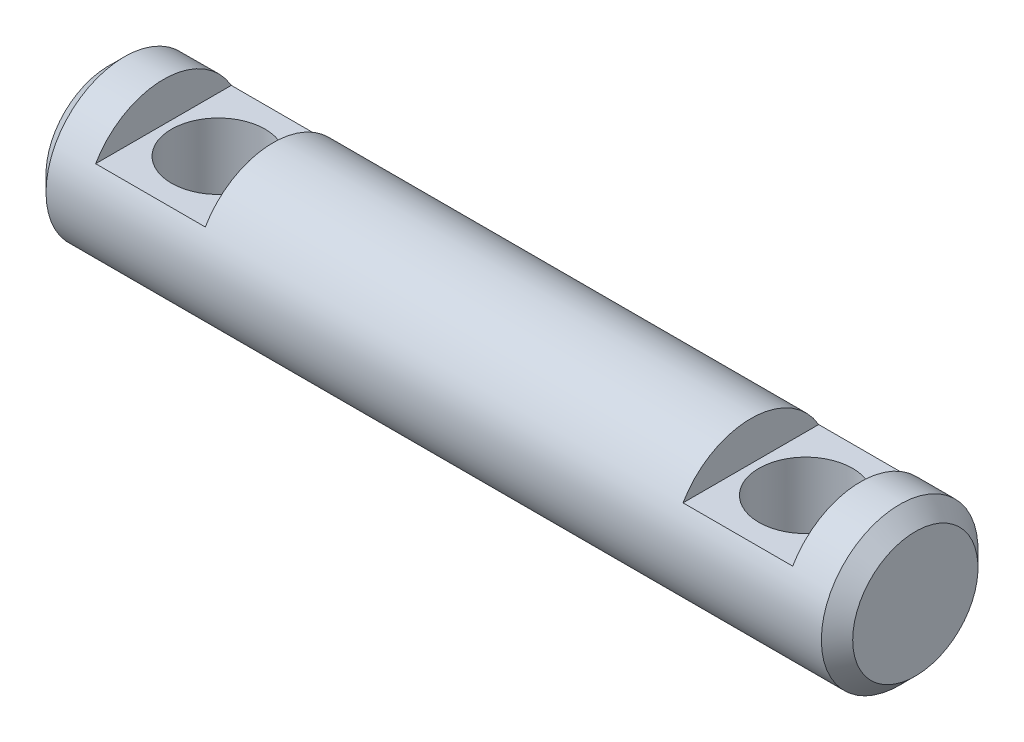
ISO-10303-21;
HEADER;
FILE_DESCRIPTION(('STEP AP214'),'2;1');
FILE_NAME('part.step','',(''),(''),'','','');
FILE_SCHEMA(('AUTOMOTIVE_DESIGN { 1 0 10303 214 1 1 1 1 }'));
ENDSEC;
DATA;
#1=APPLICATION_CONTEXT('core data for automotive mechanical design processes');
#2=APPLICATION_PROTOCOL_DEFINITION('international standard','automotive_design',2000,#1);
#3=PRODUCT_CONTEXT('',#1,'mechanical');
#4=PRODUCT('Part','Part','',(#3));
#5=PRODUCT_RELATED_PRODUCT_CATEGORY('part','',(#4));
#6=PRODUCT_DEFINITION_FORMATION('','',#4);
#7=PRODUCT_DEFINITION_CONTEXT('part definition',#1,'design');
#8=PRODUCT_DEFINITION('design','',#6,#7);
#9=PRODUCT_DEFINITION_SHAPE('','',#8);
#10=(LENGTH_UNIT() NAMED_UNIT(*) SI_UNIT(.MILLI.,.METRE.));
#11=(NAMED_UNIT(*) PLANE_ANGLE_UNIT() SI_UNIT($,.RADIAN.));
#12=(NAMED_UNIT(*) SI_UNIT($,.STERADIAN.) SOLID_ANGLE_UNIT());
#13=UNCERTAINTY_MEASURE_WITH_UNIT(LENGTH_MEASURE(1.E-05),#10,'distance_accuracy_value','');
#14=(GEOMETRIC_REPRESENTATION_CONTEXT(3) GLOBAL_UNCERTAINTY_ASSIGNED_CONTEXT((#13)) GLOBAL_UNIT_ASSIGNED_CONTEXT((#10,
#11,#12)) REPRESENTATION_CONTEXT('',''));
#15=CARTESIAN_POINT('',(0.,0.,0.));
#16=DIRECTION('',(0.,0.,1.));
#17=DIRECTION('',(1.,0.,0.));
#18=AXIS2_PLACEMENT_3D('',#15,#16,#17);
#19=CARTESIAN_POINT('',(-103.,0.,0.));
#20=DIRECTION('',(-1.,0.,0.));
#21=DIRECTION('',(0.,0.,1.));
#22=AXIS2_PLACEMENT_3D('',#19,#20,#21);
#23=CYLINDRICAL_SURFACE('',#22,10.);
#24=CARTESIAN_POINT('',(-2.,0.,0.));
#25=DIRECTION('',(-1.,0.,0.));
#26=DIRECTION('',(0.,0.,1.));
#27=AXIS2_PLACEMENT_3D('',#24,#25,#26);
#28=CIRCLE('',#27,10.);
#29=CARTESIAN_POINT('',(-2.,0.,10.));
#30=VERTEX_POINT('',#29);
#31=EDGE_CURVE('E163',#30,#30,#28,.T.);
#32=ORIENTED_EDGE('',*,*,#31,.T.);
#33=EDGE_LOOP('',(#32));
#34=FACE_BOUND('',#33,.T.);
#35=CARTESIAN_POINT('',(-101.,0.,0.));
#36=DIRECTION('',(1.,0.,0.));
#37=DIRECTION('',(0.,0.,-1.));
#38=AXIS2_PLACEMENT_3D('',#35,#36,#37);
#39=CIRCLE('',#38,10.);
#40=CARTESIAN_POINT('',(-101.,0.,-10.));
#41=VERTEX_POINT('',#40);
#42=EDGE_CURVE('E147',#41,#41,#39,.T.);
#43=ORIENTED_EDGE('',*,*,#42,.T.);
#44=EDGE_LOOP('',(#43));
#45=FACE_BOUND('',#44,.T.);
#46=CARTESIAN_POINT('',(-89.,-8.01272182220249,5.98300000000001));
#47=CARTESIAN_POINT('',(-88.8493695441967,-8.01272064223742,5.98300076916407));
#48=CARTESIAN_POINT('',(-88.6987483449007,-8.01698502855143,5.97730299767915));
#49=CARTESIAN_POINT('',(-88.3988422827599,-8.03384631074094,5.95462112731751));
#50=CARTESIAN_POINT('',(-88.2495573423758,-8.0464427199133,5.93763768767662));
#51=CARTESIAN_POINT('',(-87.9534310774551,-8.07944003446093,5.89265839427143));
#52=CARTESIAN_POINT('',(-87.8065915267932,-8.0998463680192,5.86465488076986));
#53=CARTESIAN_POINT('',(-87.5164666998527,-8.14764147563162,5.79806944826704));
#54=CARTESIAN_POINT('',(-87.3731831393321,-8.17503355108398,5.75948252699081));
#55=CARTESIAN_POINT('',(-86.9521602604409,-8.26576135549159,5.6292415352638));
#56=CARTESIAN_POINT('',(-86.6807733757901,-8.33795262577152,5.52271927835579));
#57=CARTESIAN_POINT('',(-86.1600974946932,-8.49747006485556,5.27397201085588));
#58=CARTESIAN_POINT('',(-85.9108151971873,-8.58480079823948,5.13173622674491));
#59=CARTESIAN_POINT('',(-85.4078398665261,-8.77764464725457,4.79529529812045));
#60=CARTESIAN_POINT('',(-85.157290733131,-8.88407773305352,4.59687564718023));
#61=CARTESIAN_POINT('',(-84.8073881867805,-9.04272792957237,4.27127028550071));
#62=CARTESIAN_POINT('',(-84.6950052132828,-9.09548102430123,4.15798414985808));
#63=CARTESIAN_POINT('',(-84.4792962135025,-9.19954013728372,3.92237479570959));
#64=CARTESIAN_POINT('',(-84.3759718524373,-9.25084588830577,3.8000499232244));
#65=CARTESIAN_POINT('',(-84.1683989276071,-9.35624104863587,3.53319839301889));
#66=CARTESIAN_POINT('',(-84.0652478527489,-9.41003571488673,3.3876992006338));
#67=CARTESIAN_POINT('',(-83.8717430633939,-9.51293962780247,3.08694397030981));
#68=CARTESIAN_POINT('',(-83.7813836356505,-9.56205096300568,2.93169233320958));
#69=CARTESIAN_POINT('',(-83.6144121974282,-9.654191906075,2.61231434158259));
#70=CARTESIAN_POINT('',(-83.5377943317446,-9.69722410256142,2.44819180587691));
#71=CARTESIAN_POINT('',(-83.3992756065727,-9.77591805659406,2.11215187144234));
#72=CARTESIAN_POINT('',(-83.3373723453933,-9.81158101680932,1.94023575023009));
#73=CARTESIAN_POINT('',(-83.2343776641858,-9.87139954080665,1.60667280654932));
#74=CARTESIAN_POINT('',(-83.1918678445916,-9.89632642372464,1.44560182391021));
#75=CARTESIAN_POINT('',(-83.1203014048668,-9.93849728745583,1.11950408963653));
#76=CARTESIAN_POINT('',(-83.091244008052,-9.95574171181857,0.954477566956382));
#77=CARTESIAN_POINT('',(-83.0470649254576,-9.98202543969841,0.622050603429015));
#78=CARTESIAN_POINT('',(-83.0319324065546,-9.99107112150071,0.454652111031152));
#79=CARTESIAN_POINT('',(-83.0158230565459,-10.0007020232273,0.118938798777271));
#80=CARTESIAN_POINT('',(-83.0148447973063,-10.0012880967077,-0.0493759269184521));
#81=CARTESIAN_POINT('',(-83.0262970798376,-9.99443968910751,-0.364504818510457));
#82=CARTESIAN_POINT('',(-83.0370842989208,-9.98798815722642,-0.511403680401942));
#83=CARTESIAN_POINT('',(-83.0693963615166,-9.96873116935379,-0.803645261549549));
#84=CARTESIAN_POINT('',(-83.0909247072632,-9.95592364094377,-0.948987457442598));
#85=CARTESIAN_POINT('',(-83.1444414440025,-9.92425376260532,-1.23700119956706));
#86=CARTESIAN_POINT('',(-83.1764261598526,-9.90539354008437,-1.37967366553895));
#87=CARTESIAN_POINT('',(-83.2504954083546,-9.86202886115965,-1.66154510619375));
#88=CARTESIAN_POINT('',(-83.2925838373303,-9.83752222746118,-1.80074271794078));
#89=CARTESIAN_POINT('',(-83.3866704453123,-9.78323534036892,-2.07557937926212));
#90=CARTESIAN_POINT('',(-83.4387222634775,-9.75342660689977,-2.21119442550947));
#91=CARTESIAN_POINT('',(-83.5520875515019,-9.68923557027813,-2.47739677939519));
#92=CARTESIAN_POINT('',(-83.6134043171857,-9.65485164011024,-2.60798227704186));
#93=CARTESIAN_POINT('',(-83.8104741687575,-9.54582893551309,-2.99124330840833));
#94=CARTESIAN_POINT('',(-83.9594110537189,-9.46528123714766,-3.23560885139137));
#95=CARTESIAN_POINT('',(-84.3079653137776,-9.28407918781992,-3.72588355824065));
#96=CARTESIAN_POINT('',(-84.5115058498674,-9.18217270311488,-3.96851119761713));
#97=CARTESIAN_POINT('',(-84.9535425178159,-8.97437551717999,-4.41836883262399));
#98=CARTESIAN_POINT('',(-85.1920856909291,-8.86847959903703,-4.62555036644221));
#99=CARTESIAN_POINT('',(-85.5877403910169,-8.70807118302473,-4.91770378702827));
#100=CARTESIAN_POINT('',(-85.7342337575478,-8.65153813867862,-5.01621266399574));
#101=CARTESIAN_POINT('',(-86.0364158359049,-8.54205515909008,-5.20045751307668));
#102=CARTESIAN_POINT('',(-86.1921060394991,-8.48910580814401,-5.28619140504241));
#103=CARTESIAN_POINT('',(-86.5117119044083,-8.38882025951527,-5.44393495455025));
#104=CARTESIAN_POINT('',(-86.6756147753102,-8.34147569730534,-5.51596516340464));
#105=CARTESIAN_POINT('',(-87.0109587770588,-8.25432171323407,-5.64555392250757));
#106=CARTESIAN_POINT('',(-87.1823969344853,-8.21450935148779,-5.70311812186046));
#107=CARTESIAN_POINT('',(-87.4884921352161,-8.15302112355933,-5.79053988399941));
#108=CARTESIAN_POINT('',(-87.6217940247644,-8.12929384797482,-5.8237293352486));
#109=CARTESIAN_POINT('',(-87.8912679795097,-8.08797178460469,-5.88098319476086));
#110=CARTESIAN_POINT('',(-88.0274394082945,-8.07037565191022,-5.90504960432856));
#111=CARTESIAN_POINT('',(-88.301690066418,-8.041938033269,-5.94372027722394));
#112=CARTESIAN_POINT('',(-88.4397673563362,-8.03109013352325,-5.95833352575451));
#113=CARTESIAN_POINT('',(-88.7169869287104,-8.01652362501854,-5.97791767234612));
#114=CARTESIAN_POINT('',(-88.8561292340174,-8.01280516966252,-5.98288836293002));
#115=CARTESIAN_POINT('',(-89.1346100650127,-8.01264114951787,-5.98310805489964));
#116=CARTESIAN_POINT('',(-89.2739486072178,-8.01620519365379,-5.97834421201388));
#117=CARTESIAN_POINT('',(-89.5515821759019,-8.03048745872211,-5.95914526132916));
#118=CARTESIAN_POINT('',(-89.6898771970135,-8.0412057164262,-5.94471010382094));
#119=CARTESIAN_POINT('',(-89.9645153133849,-8.06940751142638,-5.90637176329846));
#120=CARTESIAN_POINT('',(-90.1008574419148,-8.08689428691881,-5.88246404829075));
#121=CARTESIAN_POINT('',(-90.3706932083969,-8.12801880548731,-5.82550731341103));
#122=CARTESIAN_POINT('',(-90.5041856603671,-8.15165905753131,-5.79245456447129));
#123=CARTESIAN_POINT('',(-90.8990572986649,-8.23066350006933,-5.68019283837786));
#124=CARTESIAN_POINT('',(-91.1552071394002,-8.29415340583934,-5.58782650554204));
#125=CARTESIAN_POINT('',(-91.6490522486616,-8.43593183154594,-5.37138185595329));
#126=CARTESIAN_POINT('',(-91.8867404783902,-8.51422595714442,-5.24729152052587));
#127=CARTESIAN_POINT('',(-92.382424296076,-8.69379030137845,-4.94510654755516));
#128=CARTESIAN_POINT('',(-92.6364063257457,-8.79666204440342,-4.76131630780502));
#129=CARTESIAN_POINT('',(-92.9932379914118,-8.95199474555176,-4.45811381784627));
#130=CARTESIAN_POINT('',(-93.1082385555798,-9.00398410439696,-4.35236690475313));
#131=CARTESIAN_POINT('',(-93.3298363189521,-9.10722655605006,-4.13197446075147));
#132=CARTESIAN_POINT('',(-93.4364320323013,-9.15847951736975,-4.01732736349792));
#133=CARTESIAN_POINT('',(-93.6538035736423,-9.26561058833824,-3.76426499577172));
#134=CARTESIAN_POINT('',(-93.7633554681407,-9.32123638058279,-3.6246888281353));
#135=CARTESIAN_POINT('',(-93.9702020193509,-9.4286165617675,-3.33541279813997));
#136=CARTESIAN_POINT('',(-94.0675016553776,-9.48037251991089,-3.18571708662086));
#137=CARTESIAN_POINT('',(-94.2489554259704,-9.57859205618555,-2.87694481209014));
#138=CARTESIAN_POINT('',(-94.3331126462884,-9.62505687594499,-2.71787046323976));
#139=CARTESIAN_POINT('',(-94.4873110120881,-9.71134434422112,-2.39129657813955));
#140=CARTESIAN_POINT('',(-94.557354087434,-9.75116790068672,-2.22379819764876));
#141=CARTESIAN_POINT('',(-94.6777555848786,-9.82030416756388,-1.89416788789084));
#142=CARTESIAN_POINT('',(-94.72918053772,-9.85017334517986,-1.73254250614256));
#143=CARTESIAN_POINT('',(-94.8183338031475,-9.9022931198655,-1.40434584828176));
#144=CARTESIAN_POINT('',(-94.8560626356142,-9.92454400611021,-1.23777476015921));
#145=CARTESIAN_POINT('',(-94.917193383354,-9.96073701499938,-0.901290161059266));
#146=CARTESIAN_POINT('',(-94.9406086017846,-9.97468685236652,-0.731379905614245));
#147=CARTESIAN_POINT('',(-94.9727598570552,-9.9938682289815,-0.389694564109092));
#148=CARTESIAN_POINT('',(-94.9814977755949,-9.99910088581274,-0.21791971994054));
#149=CARTESIAN_POINT('',(-94.9839717170663,-10.000581669364,0.102981889168161));
#150=CARTESIAN_POINT('',(-94.9795422819112,-9.9979284977738,0.252093449395305));
#151=CARTESIAN_POINT('',(-94.9595914305091,-9.9860089972031,0.549306698574361));
#152=CARTESIAN_POINT('',(-94.9440702782624,-9.9767428256224,0.697408411477522));
#153=CARTESIAN_POINT('',(-94.902141449322,-9.95181899650118,0.991503577720533));
#154=CARTESIAN_POINT('',(-94.8757342831971,-9.9361616387163,1.13749712960365));
#155=CARTESIAN_POINT('',(-94.8123649207155,-9.89882026197122,1.42638527794544));
#156=CARTESIAN_POINT('',(-94.7754024028243,-9.87713605942338,1.56927977985896));
#157=CARTESIAN_POINT('',(-94.6919816384061,-9.82859256232503,1.84894553803294));
#158=CARTESIAN_POINT('',(-94.6456756255632,-9.80181658681472,1.98577674530442));
#159=CARTESIAN_POINT('',(-94.5437018531575,-9.74343890823917,2.25485854369877));
#160=CARTESIAN_POINT('',(-94.4880310598068,-9.71183564164449,2.38710763361452));
#161=CARTESIAN_POINT('',(-94.3077175439051,-9.61070281482897,2.7759583144002));
#162=CARTESIAN_POINT('',(-94.1697144311881,-9.53481486978578,3.02485941306703));
#163=CARTESIAN_POINT('',(-93.8454170755404,-9.3627377786203,3.52367290425509));
#164=CARTESIAN_POINT('',(-93.6555032006902,-9.26523835504875,3.7707514156183));
#165=CARTESIAN_POINT('',(-93.2409954031973,-9.06404235493718,4.23159002951522));
#166=CARTESIAN_POINT('',(-93.0163627208972,-8.96033893262195,4.44531235100055));
#167=CARTESIAN_POINT('',(-92.6412618336266,-8.80043212549768,4.75056595747517));
#168=CARTESIAN_POINT('',(-92.5012545031753,-8.74326578549942,4.85469472816388));
#169=CARTESIAN_POINT('',(-92.211899670652,-8.63146537677396,5.05079450922767));
#170=CARTESIAN_POINT('',(-92.0625498846735,-8.5768319329805,5.14276252947545));
#171=CARTESIAN_POINT('',(-91.7551917173342,-8.47194988111722,5.31376837955461));
#172=CARTESIAN_POINT('',(-91.597185090061,-8.42170039006161,5.39280881598985));
#173=CARTESIAN_POINT('',(-91.2732970522639,-8.32752168936161,5.5371298725375));
#174=CARTESIAN_POINT('',(-91.1074210802458,-8.28358819697648,5.60241983064973));
#175=CARTESIAN_POINT('',(-90.78463866472,-8.20770442689692,5.71293744193133));
#176=CARTESIAN_POINT('',(-90.6283549754564,-8.17501588819394,5.75947412324479));
#177=CARTESIAN_POINT('',(-90.311176679106,-8.11779511350027,5.83984955000091));
#178=CARTESIAN_POINT('',(-90.1502851046049,-8.09325764120974,5.87369644924969));
#179=CARTESIAN_POINT('',(-89.8253685922711,-8.05350833339581,5.92808089753495));
#180=CARTESIAN_POINT('',(-89.6613487440117,-8.03828249423286,5.94863843493248));
#181=CARTESIAN_POINT('',(-89.3315487291852,-8.01789044412063,5.97609680783655));
#182=CARTESIAN_POINT('',(-89.1657687593173,-8.01272312075359,5.98299915353524));
#183=CARTESIAN_POINT('',(-89.,-8.01272182220249,5.98300000000001));
#184=B_SPLINE_CURVE_WITH_KNOTS('',3,(#46,#47,#48,#49,#50,#51,#52,#53,#54,#55,#56,#57,#58,#59,
#60,#61,#62,#63,#64,#65,#66,#67,#68,#69,#70,#71,#72,#73,#74,#75,#76,#77,#78,#79,#80,#81,#82,#83,
#84,#85,#86,#87,#88,#89,#90,#91,#92,#93,#94,#95,#96,#97,#98,#99,#100,#101,#102,#103,#104,#105,
#106,#107,#108,#109,#110,#111,#112,#113,#114,#115,#116,#117,#118,#119,#120,#121,#122,#123,#124,
#125,#126,#127,#128,#129,#130,#131,#132,#133,#134,#135,#136,#137,#138,#139,#140,#141,#142,#143,
#144,#145,#146,#147,#148,#149,#150,#151,#152,#153,#154,#155,#156,#157,#158,#159,#160,#161,#162,
#163,#164,#165,#166,#167,#168,#169,#170,#171,#172,#173,#174,#175,#176,#177,#178,#179,#180,#181,
#182,#183),.UNSPECIFIED.,.T.,.F.,(4,2,2,2,2,2,2,2,2,2,2,2,2,2,2,2,2,2,2,2,2,2,2,2,2,2,2,2,2,2,2,
2,2,2,2,2,2,2,2,2,2,2,2,2,2,2,2,2,2,2,2,2,2,2,2,2,2,2,2,2,2,2,2,2,2,2,2,2,4),(0.,
0.451709047346672,0.903391711088071,1.35538888259686,1.80760006099144,2.70454700171403,
3.60176484564895,4.60799204644236,5.11180552428526,5.61571142329459,6.17385340051518,
6.73174529797644,7.2893989130495,7.84696144631437,8.35155852130122,8.85612645941584,
9.36030152662058,9.86442572330245,10.3062041903912,10.7481267972679,11.1898942465134,
11.631832330249,12.0762201972984,12.5207665204705,13.4092655997762,14.4035706643091,
15.399224460951,15.9547362159554,16.5103383261925,17.0651005199553,17.6196457363586,
18.0374406282247,18.4551438160943,18.8724493926191,19.2897639481307,19.7076294866373,
20.1254971729331,20.5435650232099,20.9618036007745,21.7971461313442,22.6328056025755,
23.6184705099789,24.1120734231972,24.6057634034774,25.1629125996724,25.7198346347546,
26.2766257110053,26.8333406040065,27.3492495133178,27.8651388375896,28.3805479593832,
28.8958909982247,29.3429431294542,29.7899846204974,30.2370051470745,30.6840392921274,
31.1243055163002,31.5647146435229,32.4449158462116,33.4208424912917,34.39786662543,
34.9481482575721,35.4985649442482,36.0488705125809,36.5988011526857,37.0970331185637,
37.5949443951046,38.0921050163127,38.5892106511045),.UNSPECIFIED.);
#185=CARTESIAN_POINT('',(-89.,-8.01272182220249,5.98300000000001));
#186=VERTEX_POINT('',#185);
#187=EDGE_CURVE('E155',#186,#186,#184,.T.);
#188=ORIENTED_EDGE('',*,*,#187,.T.);
#189=EDGE_LOOP('',(#188));
#190=FACE_BOUND('',#189,.T.);
#191=CARTESIAN_POINT('',(-14.,-8.01272182220249,5.983));
#192=CARTESIAN_POINT('',(-13.8493695441967,-8.01272064223742,5.98300076916407));
#193=CARTESIAN_POINT('',(-13.6987483449007,-8.01698502855143,5.97730299767914));
#194=CARTESIAN_POINT('',(-13.39884228276,-8.03384631074094,5.9546211273175));
#195=CARTESIAN_POINT('',(-13.2495573423758,-8.0464427199133,5.93763768767662));
#196=CARTESIAN_POINT('',(-12.9534310774551,-8.07944003446093,5.89265839427143));
#197=CARTESIAN_POINT('',(-12.8065915267932,-8.0998463680192,5.86465488076986));
#198=CARTESIAN_POINT('',(-12.5164666998527,-8.14764147563162,5.79806944826703));
#199=CARTESIAN_POINT('',(-12.3731831393321,-8.17503355108398,5.75948252699081));
#200=CARTESIAN_POINT('',(-11.9521602604409,-8.26576135549159,5.62924153526379));
#201=CARTESIAN_POINT('',(-11.6807733757901,-8.33795262577153,5.52271927835578));
#202=CARTESIAN_POINT('',(-11.1600974946932,-8.49747006485556,5.27397201085588));
#203=CARTESIAN_POINT('',(-10.9108151971873,-8.58480079823949,5.13173622674491));
#204=CARTESIAN_POINT('',(-10.4078398665261,-8.77764464725458,4.79529529812044));
#205=CARTESIAN_POINT('',(-10.157290733131,-8.88407773305352,4.59687564718022));
#206=CARTESIAN_POINT('',(-9.80738818678048,-9.04272792957238,4.27127028550069));
#207=CARTESIAN_POINT('',(-9.69500521328284,-9.09548102430124,4.15798414985806));
#208=CARTESIAN_POINT('',(-9.47929621350256,-9.19954013728373,3.92237479570958));
#209=CARTESIAN_POINT('',(-9.37597185243732,-9.25084588830577,3.80004992322439));
#210=CARTESIAN_POINT('',(-9.16839892760712,-9.35624104863588,3.53319839301888));
#211=CARTESIAN_POINT('',(-9.06524785274892,-9.41003571488673,3.38769920063378));
#212=CARTESIAN_POINT('',(-8.87174306339386,-9.51293962780248,3.0869439703098));
#213=CARTESIAN_POINT('',(-8.78138363565049,-9.56205096300568,2.93169233320957));
#214=CARTESIAN_POINT('',(-8.61441219742821,-9.654191906075,2.61231434158258));
#215=CARTESIAN_POINT('',(-8.53779433174464,-9.69722410256142,2.4481918058769));
#216=CARTESIAN_POINT('',(-8.39927560657277,-9.77591805659406,2.11215187144233));
#217=CARTESIAN_POINT('',(-8.33737234539335,-9.81158101680932,1.94023575023008));
#218=CARTESIAN_POINT('',(-8.23437766418582,-9.87139954080665,1.60667280654932));
#219=CARTESIAN_POINT('',(-8.19186784459157,-9.89632642372464,1.4456018239102));
#220=CARTESIAN_POINT('',(-8.12030140486683,-9.93849728745583,1.11950408963652));
#221=CARTESIAN_POINT('',(-8.09124400805202,-9.95574171181858,0.954477566956375));
#222=CARTESIAN_POINT('',(-8.04706492545767,-9.98202543969841,0.622050603429007));
#223=CARTESIAN_POINT('',(-8.03193240655459,-9.99107112150071,0.454652111031144));
#224=CARTESIAN_POINT('',(-8.01582305654594,-10.0007020232273,0.118938798777263));
#225=CARTESIAN_POINT('',(-8.01484479730633,-10.0012880967077,-0.0493759269184598));
#226=CARTESIAN_POINT('',(-8.02629707983761,-9.99443968910751,-0.364504818510465));
#227=CARTESIAN_POINT('',(-8.03708429892086,-9.98798815722642,-0.51140368040195));
#228=CARTESIAN_POINT('',(-8.06939636151662,-9.96873116935379,-0.803645261549558));
#229=CARTESIAN_POINT('',(-8.09092470726321,-9.95592364094377,-0.948987457442608));
#230=CARTESIAN_POINT('',(-8.14444144400251,-9.92425376260531,-1.23700119956707));
#231=CARTESIAN_POINT('',(-8.1764261598526,-9.90539354008437,-1.37967366553896));
#232=CARTESIAN_POINT('',(-8.25049540835462,-9.86202886115965,-1.66154510619376));
#233=CARTESIAN_POINT('',(-8.29258383733036,-9.83752222746118,-1.80074271794079));
#234=CARTESIAN_POINT('',(-8.38667044531237,-9.78323534036892,-2.07557937926213));
#235=CARTESIAN_POINT('',(-8.43872226347756,-9.75342660689977,-2.21119442550948));
#236=CARTESIAN_POINT('',(-8.55208755150195,-9.68923557027812,-2.4773967793952));
#237=CARTESIAN_POINT('',(-8.61340431718571,-9.65485164011024,-2.60798227704187));
#238=CARTESIAN_POINT('',(-8.81047416875749,-9.54582893551309,-2.99124330840834));
#239=CARTESIAN_POINT('',(-8.95941105371891,-9.46528123714766,-3.23560885139138));
#240=CARTESIAN_POINT('',(-9.30796531377764,-9.28407918781992,-3.72588355824065));
#241=CARTESIAN_POINT('',(-9.51150584986742,-9.18217270311487,-3.96851119761714));
#242=CARTESIAN_POINT('',(-9.95354251781596,-8.97437551717999,-4.418368832624));
#243=CARTESIAN_POINT('',(-10.1920856909292,-8.86847959903703,-4.62555036644221));
#244=CARTESIAN_POINT('',(-10.5877403910169,-8.70807118302473,-4.91770378702827));
#245=CARTESIAN_POINT('',(-10.7342337575479,-8.65153813867862,-5.01621266399574));
#246=CARTESIAN_POINT('',(-11.036415835905,-8.54205515909008,-5.20045751307669));
#247=CARTESIAN_POINT('',(-11.1921060394991,-8.48910580814401,-5.28619140504241));
#248=CARTESIAN_POINT('',(-11.5117119044083,-8.38882025951527,-5.44393495455025));
#249=CARTESIAN_POINT('',(-11.6756147753102,-8.34147569730534,-5.51596516340463));
#250=CARTESIAN_POINT('',(-12.0109587770589,-8.25432171323408,-5.64555392250756));
#251=CARTESIAN_POINT('',(-12.1823969344854,-8.21450935148779,-5.70311812186046));
#252=CARTESIAN_POINT('',(-12.4884921352161,-8.15302112355933,-5.79053988399941));
#253=CARTESIAN_POINT('',(-12.6217940247644,-8.12929384797482,-5.8237293352486));
#254=CARTESIAN_POINT('',(-12.8912679795097,-8.08797178460469,-5.88098319476085));
#255=CARTESIAN_POINT('',(-13.0274394082945,-8.07037565191023,-5.90504960432856));
#256=CARTESIAN_POINT('',(-13.301690066418,-8.04193803326901,-5.94372027722393));
#257=CARTESIAN_POINT('',(-13.4397673563362,-8.03109013352325,-5.9583335257545));
#258=CARTESIAN_POINT('',(-13.7169869287104,-8.01652362501854,-5.97791767234611));
#259=CARTESIAN_POINT('',(-13.8561292340174,-8.01280516966252,-5.98288836293002));
#260=CARTESIAN_POINT('',(-14.1346100650127,-8.01264114951788,-5.98310805489964));
#261=CARTESIAN_POINT('',(-14.2739486072178,-8.01620519365379,-5.97834421201388));
#262=CARTESIAN_POINT('',(-14.5515821759019,-8.03048745872211,-5.95914526132916));
#263=CARTESIAN_POINT('',(-14.6898771970135,-8.0412057164262,-5.94471010382094));
#264=CARTESIAN_POINT('',(-14.9645153133849,-8.06940751142638,-5.90637176329846));
#265=CARTESIAN_POINT('',(-15.1008574419148,-8.08689428691881,-5.88246404829075));
#266=CARTESIAN_POINT('',(-15.3706932083968,-8.1280188054873,-5.82550731341103));
#267=CARTESIAN_POINT('',(-15.5041856603671,-8.15165905753131,-5.79245456447129));
#268=CARTESIAN_POINT('',(-15.8990572986649,-8.23066350006933,-5.68019283837786));
#269=CARTESIAN_POINT('',(-16.1552071394002,-8.29415340583934,-5.58782650554205));
#270=CARTESIAN_POINT('',(-16.6490522486616,-8.43593183154593,-5.3713818559533));
#271=CARTESIAN_POINT('',(-16.8867404783902,-8.51422595714442,-5.24729152052588));
#272=CARTESIAN_POINT('',(-17.382424296076,-8.69379030137845,-4.94510654755516));
#273=CARTESIAN_POINT('',(-17.6364063257457,-8.79666204440342,-4.76131630780502));
#274=CARTESIAN_POINT('',(-17.9932379914118,-8.95199474555176,-4.45811381784626));
#275=CARTESIAN_POINT('',(-18.1082385555798,-9.00398410439697,-4.35236690475312));
#276=CARTESIAN_POINT('',(-18.3298363189522,-9.10722655605007,-4.13197446075146));
#277=CARTESIAN_POINT('',(-18.4364320323013,-9.15847951736975,-4.01732736349791));
#278=CARTESIAN_POINT('',(-18.6538035736424,-9.26561058833825,-3.76426499577172));
#279=CARTESIAN_POINT('',(-18.7633554681407,-9.32123638058279,-3.62468882813529));
#280=CARTESIAN_POINT('',(-18.9702020193509,-9.4286165617675,-3.33541279813996));
#281=CARTESIAN_POINT('',(-19.0675016553776,-9.4803725199109,-3.18571708662085));
#282=CARTESIAN_POINT('',(-19.2489554259704,-9.57859205618555,-2.87694481209013));
#283=CARTESIAN_POINT('',(-19.3331126462884,-9.62505687594499,-2.71787046323975));
#284=CARTESIAN_POINT('',(-19.4873110120881,-9.71134434422112,-2.39129657813955));
#285=CARTESIAN_POINT('',(-19.5573540874341,-9.75116790068672,-2.22379819764876));
#286=CARTESIAN_POINT('',(-19.6777555848786,-9.82030416756387,-1.89416788789085));
#287=CARTESIAN_POINT('',(-19.7291805377201,-9.85017334517986,-1.73254250614257));
#288=CARTESIAN_POINT('',(-19.8183338031475,-9.9022931198655,-1.40434584828177));
#289=CARTESIAN_POINT('',(-19.8560626356142,-9.92454400611021,-1.23777476015922));
#290=CARTESIAN_POINT('',(-19.917193383354,-9.96073701499938,-0.901290161059272));
#291=CARTESIAN_POINT('',(-19.9406086017847,-9.97468685236652,-0.731379905614252));
#292=CARTESIAN_POINT('',(-19.9727598570552,-9.9938682289815,-0.389694564109099));
#293=CARTESIAN_POINT('',(-19.9814977755949,-9.99910088581274,-0.217919719940547));
#294=CARTESIAN_POINT('',(-19.9839717170663,-10.000581669364,0.102981889168155));
#295=CARTESIAN_POINT('',(-19.9795422819112,-9.9979284977738,0.252093449395299));
#296=CARTESIAN_POINT('',(-19.9595914305091,-9.9860089972031,0.549306698574354));
#297=CARTESIAN_POINT('',(-19.9440702782624,-9.9767428256224,0.697408411477514));
#298=CARTESIAN_POINT('',(-19.9021414493221,-9.95181899650119,0.991503577720525));
#299=CARTESIAN_POINT('',(-19.8757342831972,-9.9361616387163,1.13749712960364));
#300=CARTESIAN_POINT('',(-19.8123649207155,-9.89882026197122,1.42638527794543));
#301=CARTESIAN_POINT('',(-19.7754024028243,-9.87713605942338,1.56927977985895));
#302=CARTESIAN_POINT('',(-19.6919816384061,-9.82859256232503,1.84894553803293));
#303=CARTESIAN_POINT('',(-19.6456756255633,-9.80181658681472,1.98577674530442));
#304=CARTESIAN_POINT('',(-19.5437018531575,-9.74343890823917,2.25485854369877));
#305=CARTESIAN_POINT('',(-19.4880310598068,-9.71183564164449,2.38710763361452));
#306=CARTESIAN_POINT('',(-19.3077175439051,-9.61070281482898,2.77595831440019));
#307=CARTESIAN_POINT('',(-19.1697144311881,-9.53481486978578,3.02485941306702));
#308=CARTESIAN_POINT('',(-18.8454170755404,-9.3627377786203,3.52367290425508));
#309=CARTESIAN_POINT('',(-18.6555032006902,-9.26523835504876,3.77075141561829));
#310=CARTESIAN_POINT('',(-18.2409954031973,-9.06404235493719,4.23159002951521));
#311=CARTESIAN_POINT('',(-18.0163627208972,-8.96033893262195,4.44531235100054));
#312=CARTESIAN_POINT('',(-17.6412618336267,-8.80043212549768,4.75056595747516));
#313=CARTESIAN_POINT('',(-17.5012545031753,-8.74326578549943,4.85469472816387));
#314=CARTESIAN_POINT('',(-17.211899670652,-8.63146537677397,5.05079450922765));
#315=CARTESIAN_POINT('',(-17.0625498846735,-8.57683193298051,5.14276252947544));
#316=CARTESIAN_POINT('',(-16.7551917173342,-8.47194988111723,5.31376837955461));
#317=CARTESIAN_POINT('',(-16.597185090061,-8.42170039006162,5.39280881598984));
#318=CARTESIAN_POINT('',(-16.2732970522639,-8.32752168936161,5.53712987253749));
#319=CARTESIAN_POINT('',(-16.1074210802458,-8.28358819697648,5.60241983064973));
#320=CARTESIAN_POINT('',(-15.78463866472,-8.20770442689693,5.71293744193132));
#321=CARTESIAN_POINT('',(-15.6283549754565,-8.17501588819395,5.75947412324478));
#322=CARTESIAN_POINT('',(-15.311176679106,-8.11779511350028,5.8398495500009));
#323=CARTESIAN_POINT('',(-15.150285104605,-8.09325764120975,5.87369644924968));
#324=CARTESIAN_POINT('',(-14.8253685922711,-8.05350833339582,5.92808089753495));
#325=CARTESIAN_POINT('',(-14.6613487440117,-8.03828249423287,5.94863843493248));
#326=CARTESIAN_POINT('',(-14.3315487291852,-8.01789044412064,5.97609680783654));
#327=CARTESIAN_POINT('',(-14.1657687593173,-8.01272312075359,5.98299915353524));
#328=CARTESIAN_POINT('',(-14.,-8.01272182220249,5.983));
#329=B_SPLINE_CURVE_WITH_KNOTS('',3,(#191,#192,#193,#194,#195,#196,#197,#198,#199,#200,#201,
#202,#203,#204,#205,#206,#207,#208,#209,#210,#211,#212,#213,#214,#215,#216,#217,#218,#219,#220,
#221,#222,#223,#224,#225,#226,#227,#228,#229,#230,#231,#232,#233,#234,#235,#236,#237,#238,#239,
#240,#241,#242,#243,#244,#245,#246,#247,#248,#249,#250,#251,#252,#253,#254,#255,#256,#257,#258,
#259,#260,#261,#262,#263,#264,#265,#266,#267,#268,#269,#270,#271,#272,#273,#274,#275,#276,#277,
#278,#279,#280,#281,#282,#283,#284,#285,#286,#287,#288,#289,#290,#291,#292,#293,#294,#295,#296,
#297,#298,#299,#300,#301,#302,#303,#304,#305,#306,#307,#308,#309,#310,#311,#312,#313,#314,#315,
#316,#317,#318,#319,#320,#321,#322,#323,#324,#325,#326,#327,#328),.UNSPECIFIED.,.T.,.F.,(4,2,2,
2,2,2,2,2,2,2,2,2,2,2,2,2,2,2,2,2,2,2,2,2,2,2,2,2,2,2,2,2,2,2,2,2,2,2,2,2,2,2,2,2,2,2,2,2,2,2,2,
2,2,2,2,2,2,2,2,2,2,2,2,2,2,2,2,2,4),(0.,0.451709047346675,0.903391711088059,1.35538888259685,
1.80760006099145,2.70454700171403,3.60176484564896,4.60799204644237,5.11180552428526,
5.61571142329459,6.17385340051518,6.73174529797645,7.2893989130495,7.84696144631437,
8.35155852130122,8.85612645941584,9.36030152662058,9.86442572330245,10.3062041903912,
10.7481267972679,11.1898942465134,11.631832330249,12.0762201972984,12.5207665204705,
13.4092655997762,14.4035706643091,15.399224460951,15.9547362159554,16.5103383261925,
17.0651005199553,17.6196457363586,18.0374406282247,18.4551438160943,18.8724493926191,
19.2897639481307,19.7076294866372,20.1254971729331,20.5435650232098,20.9618036007745,
21.7971461313442,22.6328056025754,23.6184705099789,24.1120734231972,24.6057634034774,
25.1629125996724,25.7198346347546,26.2766257110052,26.8333406040064,27.3492495133178,
27.8651388375895,28.3805479593832,28.8958909982247,29.3429431294541,29.7899846204973,
30.2370051470745,30.6840392921274,31.1243055163002,31.5647146435229,32.4449158462116,
33.4208424912916,34.3978666254299,34.948148257572,35.4985649442481,36.0488705125808,
36.5988011526856,37.0970331185636,37.5949443951045,38.0921050163126,38.5892106511045),.UNSPECIFIED.);
#330=CARTESIAN_POINT('',(-14.,-8.01272182220249,5.983));
#331=VERTEX_POINT('',#330);
#332=EDGE_CURVE('E137',#331,#331,#329,.T.);
#333=ORIENTED_EDGE('',*,*,#332,.T.);
#334=EDGE_LOOP('',(#333));
#335=FACE_BOUND('',#334,.T.);
#336=CARTESIAN_POINT('',(-21.,0.,0.));
#337=DIRECTION('',(1.,0.,0.));
#338=DIRECTION('',(0.,0.,-1.));
#339=AXIS2_PLACEMENT_3D('',#336,#337,#338);
#340=CIRCLE('',#339,10.);
#341=CARTESIAN_POINT('',(-21.,5.,-8.66025403784439));
#342=VERTEX_POINT('',#341);
#343=CARTESIAN_POINT('',(-21.,5.,8.66025403784439));
#344=VERTEX_POINT('',#343);
#345=EDGE_CURVE('E128',#342,#344,#340,.T.);
#346=ORIENTED_EDGE('',*,*,#345,.F.);
#347=DIRECTION('',(-1.,0.,0.));
#348=VECTOR('',#347,1.);
#349=CARTESIAN_POINT('',(-103.,5.,-8.66025403784439));
#350=LINE('',#349,#348);
#351=CARTESIAN_POINT('',(-7.00000000000001,5.,-8.66025403784439));
#352=VERTEX_POINT('',#351);
#353=EDGE_CURVE('E195',#342,#352,#350,.F.);
#354=ORIENTED_EDGE('',*,*,#353,.T.);
#355=CARTESIAN_POINT('',(-7.00000000000001,0.,0.));
#356=DIRECTION('',(1.,0.,0.));
#357=DIRECTION('',(0.,0.,-1.));
#358=AXIS2_PLACEMENT_3D('',#355,#356,#357);
#359=CIRCLE('',#358,10.);
#360=CARTESIAN_POINT('',(-7.00000000000001,5.,8.66025403784439));
#361=VERTEX_POINT('',#360);
#362=EDGE_CURVE('E209',#352,#361,#359,.T.);
#363=ORIENTED_EDGE('',*,*,#362,.T.);
#364=DIRECTION('',(-1.,0.,0.));
#365=VECTOR('',#364,1.);
#366=CARTESIAN_POINT('',(-103.,5.,8.66025403784439));
#367=LINE('',#366,#365);
#368=EDGE_CURVE('E196',#361,#344,#367,.T.);
#369=ORIENTED_EDGE('',*,*,#368,.T.);
#370=EDGE_LOOP('',(#346,#354,#363,#369));
#371=FACE_BOUND('',#370,.T.);
#372=CARTESIAN_POINT('',(-82.,0.,0.));
#373=DIRECTION('',(-1.,0.,0.));
#374=DIRECTION('',(0.,0.,1.));
#375=AXIS2_PLACEMENT_3D('',#372,#373,#374);
#376=CIRCLE('',#375,10.);
#377=CARTESIAN_POINT('',(-82.,5.,8.66025403784439));
#378=VERTEX_POINT('',#377);
#379=CARTESIAN_POINT('',(-82.,5.,-8.66025403784439));
#380=VERTEX_POINT('',#379);
#381=EDGE_CURVE('E140',#378,#380,#376,.T.);
#382=ORIENTED_EDGE('',*,*,#381,.F.);
#383=DIRECTION('',(-1.,0.,0.));
#384=VECTOR('',#383,1.);
#385=CARTESIAN_POINT('',(-103.,5.,8.66025403784439));
#386=LINE('',#385,#384);
#387=CARTESIAN_POINT('',(-96.,5.,8.66025403784439));
#388=VERTEX_POINT('',#387);
#389=EDGE_CURVE('E133',#378,#388,#386,.T.);
#390=ORIENTED_EDGE('',*,*,#389,.T.);
#391=CARTESIAN_POINT('',(-96.,0.,0.));
#392=DIRECTION('',(-1.,0.,0.));
#393=DIRECTION('',(0.,0.,1.));
#394=AXIS2_PLACEMENT_3D('',#391,#392,#393);
#395=CIRCLE('',#394,10.);
#396=CARTESIAN_POINT('',(-96.,5.,-8.66025403784439));
#397=VERTEX_POINT('',#396);
#398=EDGE_CURVE('E121',#388,#397,#395,.T.);
#399=ORIENTED_EDGE('',*,*,#398,.T.);
#400=DIRECTION('',(-1.,0.,0.));
#401=VECTOR('',#400,1.);
#402=CARTESIAN_POINT('',(-103.,5.,-8.66025403784439));
#403=LINE('',#402,#401);
#404=EDGE_CURVE('E127',#397,#380,#403,.F.);
#405=ORIENTED_EDGE('',*,*,#404,.T.);
#406=EDGE_LOOP('',(#382,#390,#399,#405));
#407=FACE_BOUND('',#406,.T.);
#408=ADVANCED_FACE('F80',(#34,#45,#190,#335,#371,#407),#23,.T.);
#409=CARTESIAN_POINT('',(0.,0.,0.));
#410=DIRECTION('',(-1.,0.,0.));
#411=DIRECTION('',(0.,0.,1.));
#412=AXIS2_PLACEMENT_3D('',#409,#410,#411);
#413=PLANE('',#412);
#414=CARTESIAN_POINT('',(0.,0.,0.));
#415=DIRECTION('',(-1.,0.,0.));
#416=DIRECTION('',(0.,0.,1.));
#417=AXIS2_PLACEMENT_3D('',#414,#415,#416);
#418=CIRCLE('',#417,8.00000000000001);
#419=CARTESIAN_POINT('',(0.,0.,8.00000000000001));
#420=VERTEX_POINT('',#419);
#421=EDGE_CURVE('E90',#420,#420,#418,.F.);
#422=ORIENTED_EDGE('',*,*,#421,.T.);
#423=EDGE_LOOP('',(#422));
#424=FACE_BOUND('',#423,.T.);
#425=ADVANCED_FACE('F172',(#424),#413,.F.);
#426=CARTESIAN_POINT('',(-103.,0.,0.));
#427=DIRECTION('',(1.,0.,0.));
#428=DIRECTION('',(0.,0.,-1.));
#429=AXIS2_PLACEMENT_3D('',#426,#427,#428);
#430=PLANE('',#429);
#431=CARTESIAN_POINT('',(-103.,0.,0.));
#432=DIRECTION('',(1.,0.,0.));
#433=DIRECTION('',(0.,0.,-1.));
#434=AXIS2_PLACEMENT_3D('',#431,#432,#433);
#435=CIRCLE('',#434,8.00000000000001);
#436=CARTESIAN_POINT('',(-103.,0.,-8.00000000000001));
#437=VERTEX_POINT('',#436);
#438=EDGE_CURVE('E14',#437,#437,#435,.F.);
#439=ORIENTED_EDGE('',*,*,#438,.T.);
#440=EDGE_LOOP('',(#439));
#441=FACE_BOUND('',#440,.T.);
#442=ADVANCED_FACE('F254',(#441),#430,.F.);
#443=CARTESIAN_POINT('',(-21.,5.,10.8723355622211));
#444=DIRECTION('',(0.,-1.,0.));
#445=DIRECTION('',(0.,0.,-1.));
#446=AXIS2_PLACEMENT_3D('',#443,#444,#445);
#447=PLANE('',#446);
#448=CARTESIAN_POINT('',(-14.,5.,0.));
#449=DIRECTION('',(0.,-1.,0.));
#450=DIRECTION('',(0.,0.,-1.));
#451=AXIS2_PLACEMENT_3D('',#448,#449,#450);
#452=CIRCLE('',#451,5.983);
#453=CARTESIAN_POINT('',(-14.,5.,-5.983));
#454=VERTEX_POINT('',#453);
#455=EDGE_CURVE('E156',#454,#454,#452,.T.);
#456=ORIENTED_EDGE('',*,*,#455,.T.);
#457=EDGE_LOOP('',(#456));
#458=FACE_BOUND('',#457,.T.);
#459=DIRECTION('',(0.,0.,-1.));
#460=VECTOR('',#459,1.);
#461=CARTESIAN_POINT('',(-7.,5.,10.8723355622211));
#462=LINE('',#461,#460);
#463=EDGE_CURVE('E103',#361,#352,#462,.T.);
#464=ORIENTED_EDGE('',*,*,#463,.T.);
#465=ORIENTED_EDGE('',*,*,#353,.F.);
#466=DIRECTION('',(0.,0.,-1.));
#467=VECTOR('',#466,1.);
#468=CARTESIAN_POINT('',(-21.,5.,10.8723355622211));
#469=LINE('',#468,#467);
#470=EDGE_CURVE('E212',#344,#342,#469,.T.);
#471=ORIENTED_EDGE('',*,*,#470,.F.);
#472=ORIENTED_EDGE('',*,*,#368,.F.);
#473=EDGE_LOOP('',(#464,#465,#471,#472));
#474=FACE_BOUND('',#473,.T.);
#475=ADVANCED_FACE('F251',(#458,#474),#447,.F.);
#476=CARTESIAN_POINT('',(-21.,0.,0.));
#477=DIRECTION('',(1.,0.,0.));
#478=DIRECTION('',(0.,0.,-1.));
#479=AXIS2_PLACEMENT_3D('',#476,#477,#478);
#480=PLANE('',#479);
#481=ORIENTED_EDGE('',*,*,#345,.T.);
#482=ORIENTED_EDGE('',*,*,#470,.T.);
#483=EDGE_LOOP('',(#481,#482));
#484=FACE_BOUND('',#483,.T.);
#485=ADVANCED_FACE('F248',(#484),#480,.T.);
#486=CARTESIAN_POINT('',(-7.,0.,0.));
#487=DIRECTION('',(1.,0.,0.));
#488=DIRECTION('',(0.,0.,-1.));
#489=AXIS2_PLACEMENT_3D('',#486,#487,#488);
#490=PLANE('',#489);
#491=ORIENTED_EDGE('',*,*,#463,.F.);
#492=ORIENTED_EDGE('',*,*,#362,.F.);
#493=EDGE_LOOP('',(#491,#492));
#494=FACE_BOUND('',#493,.T.);
#495=ADVANCED_FACE('F246',(#494),#490,.F.);
#496=CARTESIAN_POINT('',(-82.,5.,-15.));
#497=DIRECTION('',(0.,-1.,0.));
#498=DIRECTION('',(0.,0.,-1.));
#499=AXIS2_PLACEMENT_3D('',#496,#497,#498);
#500=PLANE('',#499);
#501=CARTESIAN_POINT('',(-89.,5.,0.));
#502=DIRECTION('',(0.,-1.,0.));
#503=DIRECTION('',(0.,0.,-1.));
#504=AXIS2_PLACEMENT_3D('',#501,#502,#503);
#505=CIRCLE('',#504,5.98300000000001);
#506=CARTESIAN_POINT('',(-89.,5.,-5.98300000000001));
#507=VERTEX_POINT('',#506);
#508=EDGE_CURVE('E151',#507,#507,#505,.T.);
#509=ORIENTED_EDGE('',*,*,#508,.T.);
#510=EDGE_LOOP('',(#509));
#511=FACE_BOUND('',#510,.T.);
#512=DIRECTION('',(0.,0.,1.));
#513=VECTOR('',#512,1.);
#514=CARTESIAN_POINT('',(-82.,5.,-15.));
#515=LINE('',#514,#513);
#516=EDGE_CURVE('E136',#380,#378,#515,.T.);
#517=ORIENTED_EDGE('',*,*,#516,.F.);
#518=ORIENTED_EDGE('',*,*,#404,.F.);
#519=DIRECTION('',(0.,0.,1.));
#520=VECTOR('',#519,1.);
#521=CARTESIAN_POINT('',(-96.,5.,-15.));
#522=LINE('',#521,#520);
#523=EDGE_CURVE('E96',#397,#388,#522,.T.);
#524=ORIENTED_EDGE('',*,*,#523,.T.);
#525=ORIENTED_EDGE('',*,*,#389,.F.);
#526=EDGE_LOOP('',(#517,#518,#524,#525));
#527=FACE_BOUND('',#526,.T.);
#528=ADVANCED_FACE('F132',(#511,#527),#500,.F.);
#529=CARTESIAN_POINT('',(-82.,0.,0.));
#530=DIRECTION('',(-1.,0.,0.));
#531=DIRECTION('',(0.,0.,1.));
#532=AXIS2_PLACEMENT_3D('',#529,#530,#531);
#533=PLANE('',#532);
#534=ORIENTED_EDGE('',*,*,#381,.T.);
#535=ORIENTED_EDGE('',*,*,#516,.T.);
#536=EDGE_LOOP('',(#534,#535));
#537=FACE_BOUND('',#536,.T.);
#538=ADVANCED_FACE('F238',(#537),#533,.T.);
#539=CARTESIAN_POINT('',(-96.,0.,0.));
#540=DIRECTION('',(-1.,0.,0.));
#541=DIRECTION('',(0.,0.,1.));
#542=AXIS2_PLACEMENT_3D('',#539,#540,#541);
#543=PLANE('',#542);
#544=ORIENTED_EDGE('',*,*,#523,.F.);
#545=ORIENTED_EDGE('',*,*,#398,.F.);
#546=EDGE_LOOP('',(#544,#545));
#547=FACE_BOUND('',#546,.T.);
#548=ADVANCED_FACE('F122',(#547),#543,.F.);
#549=CARTESIAN_POINT('',(-89.,-10.,0.));
#550=DIRECTION('',(0.,1.,0.));
#551=DIRECTION('',(0.,0.,1.));
#552=AXIS2_PLACEMENT_3D('',#549,#550,#551);
#553=CYLINDRICAL_SURFACE('',#552,5.98300000000001);
#554=ORIENTED_EDGE('',*,*,#508,.F.);
#555=EDGE_LOOP('',(#554));
#556=FACE_BOUND('',#555,.T.);
#557=ORIENTED_EDGE('',*,*,#187,.F.);
#558=EDGE_LOOP('',(#557));
#559=FACE_BOUND('',#558,.T.);
#560=ADVANCED_FACE('F235',(#556,#559),#553,.F.);
#561=CARTESIAN_POINT('',(-14.,-10.,0.));
#562=DIRECTION('',(0.,1.,0.));
#563=DIRECTION('',(0.,0.,1.));
#564=AXIS2_PLACEMENT_3D('',#561,#562,#563);
#565=CYLINDRICAL_SURFACE('',#564,5.983);
#566=ORIENTED_EDGE('',*,*,#455,.F.);
#567=EDGE_LOOP('',(#566));
#568=FACE_BOUND('',#567,.T.);
#569=ORIENTED_EDGE('',*,*,#332,.F.);
#570=EDGE_LOOP('',(#569));
#571=FACE_BOUND('',#570,.T.);
#572=ADVANCED_FACE('F177',(#568,#571),#565,.F.);
#573=CARTESIAN_POINT('',(-2.,0.,0.));
#574=DIRECTION('',(-1.,0.,0.));
#575=DIRECTION('',(0.,0.,1.));
#576=AXIS2_PLACEMENT_3D('',#573,#574,#575);
#577=CONICAL_SURFACE('',#576,10.,0.785398163397446);
#578=ORIENTED_EDGE('',*,*,#421,.F.);
#579=EDGE_LOOP('',(#578));
#580=FACE_BOUND('',#579,.T.);
#581=ORIENTED_EDGE('',*,*,#31,.F.);
#582=EDGE_LOOP('',(#581));
#583=FACE_BOUND('',#582,.T.);
#584=ADVANCED_FACE('F174',(#580,#583),#577,.T.);
#585=CARTESIAN_POINT('',(-103.,0.,0.));
#586=DIRECTION('',(1.,0.,0.));
#587=DIRECTION('',(0.,0.,-1.));
#588=AXIS2_PLACEMENT_3D('',#585,#586,#587);
#589=CONICAL_SURFACE('',#588,8.00000000000001,0.785398163397446);
#590=ORIENTED_EDGE('',*,*,#42,.F.);
#591=EDGE_LOOP('',(#590));
#592=FACE_BOUND('',#591,.T.);
#593=ORIENTED_EDGE('',*,*,#438,.F.);
#594=EDGE_LOOP('',(#593));
#595=FACE_BOUND('',#594,.T.);
#596=ADVANCED_FACE('F83',(#592,#595),#589,.T.);
#597=CLOSED_SHELL('',(#408,#425,#442,#475,#485,#495,#528,#538,#548,#560,#572,#584,#596));
#598=MANIFOLD_SOLID_BREP('B2',#597);
#599=ADVANCED_BREP_SHAPE_REPRESENTATION('',(#18,#598),#14);
#600=SHAPE_DEFINITION_REPRESENTATION(#9,#599);
ENDSEC;
END-ISO-10303-21;
